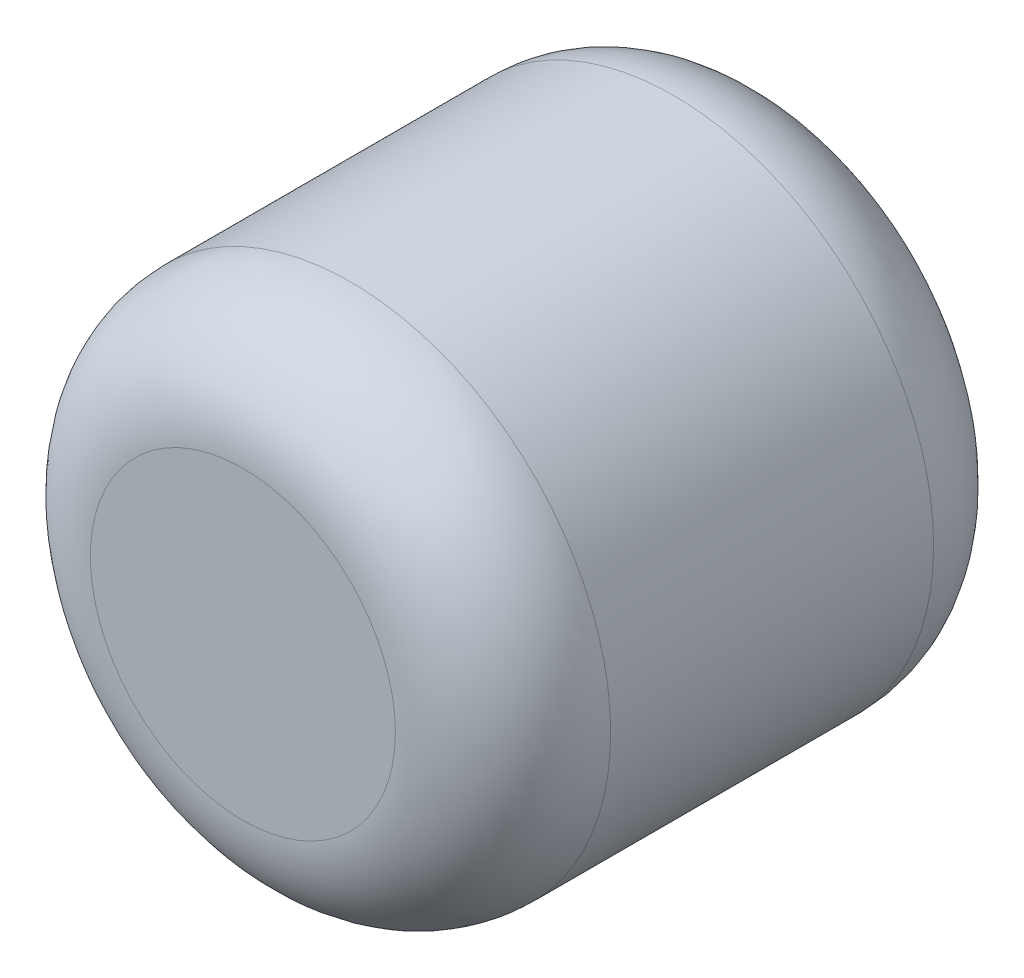
ISO-10303-21;
HEADER;
FILE_DESCRIPTION(('STEP AP214'),'2;1');
FILE_NAME('part.step','',(''),(''),'','','');
FILE_SCHEMA(('AUTOMOTIVE_DESIGN { 1 0 10303 214 1 1 1 1 }'));
ENDSEC;
DATA;
#1=APPLICATION_CONTEXT('core data for automotive mechanical design processes');
#2=APPLICATION_PROTOCOL_DEFINITION('international standard','automotive_design',2000,#1);
#3=PRODUCT_CONTEXT('',#1,'mechanical');
#4=PRODUCT('Part','Part','',(#3));
#5=PRODUCT_RELATED_PRODUCT_CATEGORY('part','',(#4));
#6=PRODUCT_DEFINITION_FORMATION('','',#4);
#7=PRODUCT_DEFINITION_CONTEXT('part definition',#1,'design');
#8=PRODUCT_DEFINITION('design','',#6,#7);
#9=PRODUCT_DEFINITION_SHAPE('','',#8);
#10=(LENGTH_UNIT() NAMED_UNIT(*) SI_UNIT(.MILLI.,.METRE.));
#11=(NAMED_UNIT(*) PLANE_ANGLE_UNIT() SI_UNIT($,.RADIAN.));
#12=(NAMED_UNIT(*) SI_UNIT($,.STERADIAN.) SOLID_ANGLE_UNIT());
#13=UNCERTAINTY_MEASURE_WITH_UNIT(LENGTH_MEASURE(1.E-05),#10,'distance_accuracy_value','');
#14=(GEOMETRIC_REPRESENTATION_CONTEXT(3) GLOBAL_UNCERTAINTY_ASSIGNED_CONTEXT((#13)) GLOBAL_UNIT_ASSIGNED_CONTEXT((#10,
#11,#12)) REPRESENTATION_CONTEXT('',''));
#15=CARTESIAN_POINT('',(0.,0.,0.));
#16=DIRECTION('',(0.,0.,1.));
#17=DIRECTION('',(1.,0.,0.));
#18=AXIS2_PLACEMENT_3D('',#15,#16,#17);
#19=CARTESIAN_POINT('',(0.,0.,15.));
#20=DIRECTION('',(0.,0.,-1.));
#21=DIRECTION('',(-1.,0.,0.));
#22=AXIS2_PLACEMENT_3D('',#19,#20,#21);
#23=CYLINDRICAL_SURFACE('',#22,7.25);
#24=CARTESIAN_POINT('',(0.,0.,12.));
#25=DIRECTION('',(0.,0.,1.));
#26=DIRECTION('',(1.,0.,0.));
#27=AXIS2_PLACEMENT_3D('',#24,#25,#26);
#28=CIRCLE('',#27,7.25);
#29=CARTESIAN_POINT('',(7.25,0.,12.));
#30=VERTEX_POINT('',#29);
#31=EDGE_CURVE('E42',#30,#30,#28,.F.);
#32=ORIENTED_EDGE('',*,*,#31,.T.);
#33=EDGE_LOOP('',(#32));
#34=FACE_BOUND('',#33,.T.);
#35=CARTESIAN_POINT('',(0.,0.,3.));
#36=DIRECTION('',(0.,0.,1.));
#37=DIRECTION('',(1.,0.,0.));
#38=AXIS2_PLACEMENT_3D('',#35,#36,#37);
#39=CIRCLE('',#38,7.25);
#40=CARTESIAN_POINT('',(7.25,0.,3.));
#41=VERTEX_POINT('',#40);
#42=EDGE_CURVE('E46',#41,#41,#39,.T.);
#43=ORIENTED_EDGE('',*,*,#42,.T.);
#44=EDGE_LOOP('',(#43));
#45=FACE_BOUND('',#44,.T.);
#46=ADVANCED_FACE('F35',(#34,#45),#23,.T.);
#47=CARTESIAN_POINT('',(0.,0.,15.));
#48=DIRECTION('',(0.,0.,1.));
#49=DIRECTION('',(1.,0.,0.));
#50=AXIS2_PLACEMENT_3D('',#47,#48,#49);
#51=PLANE('',#50);
#52=CARTESIAN_POINT('',(0.,0.,15.));
#53=DIRECTION('',(0.,0.,1.));
#54=DIRECTION('',(1.,0.,0.));
#55=AXIS2_PLACEMENT_3D('',#52,#53,#54);
#56=CIRCLE('',#55,4.25);
#57=CARTESIAN_POINT('',(4.25,0.,15.));
#58=VERTEX_POINT('',#57);
#59=EDGE_CURVE('E50',#58,#58,#56,.T.);
#60=ORIENTED_EDGE('',*,*,#59,.T.);
#61=EDGE_LOOP('',(#60));
#62=FACE_BOUND('',#61,.T.);
#63=ADVANCED_FACE('F56',(#62),#51,.T.);
#64=CARTESIAN_POINT('',(0.,0.,0.));
#65=DIRECTION('',(0.,0.,1.));
#66=DIRECTION('',(1.,0.,0.));
#67=AXIS2_PLACEMENT_3D('',#64,#65,#66);
#68=PLANE('',#67);
#69=CARTESIAN_POINT('',(0.,0.,0.));
#70=DIRECTION('',(0.,0.,1.));
#71=DIRECTION('',(1.,0.,0.));
#72=AXIS2_PLACEMENT_3D('',#69,#70,#71);
#73=CIRCLE('',#72,4.25);
#74=CARTESIAN_POINT('',(4.25,0.,0.));
#75=VERTEX_POINT('',#74);
#76=EDGE_CURVE('E10',#75,#75,#73,.F.);
#77=ORIENTED_EDGE('',*,*,#76,.T.);
#78=EDGE_LOOP('',(#77));
#79=FACE_BOUND('',#78,.T.);
#80=ADVANCED_FACE('F60',(#79),#68,.F.);
#81=CARTESIAN_POINT('',(0.,0.,12.));
#82=DIRECTION('',(0.,0.,1.));
#83=DIRECTION('',(1.,0.,0.));
#84=AXIS2_PLACEMENT_3D('',#81,#82,#83);
#85=TOROIDAL_SURFACE('',#84,4.25,3.);
#86=ORIENTED_EDGE('',*,*,#31,.F.);
#87=EDGE_LOOP('',(#86));
#88=FACE_BOUND('',#87,.T.);
#89=ORIENTED_EDGE('',*,*,#59,.F.);
#90=EDGE_LOOP('',(#89));
#91=FACE_BOUND('',#90,.T.);
#92=ADVANCED_FACE('F58',(#88,#91),#85,.T.);
#93=CARTESIAN_POINT('',(0.,0.,3.));
#94=DIRECTION('',(0.,0.,1.));
#95=DIRECTION('',(1.,0.,0.));
#96=AXIS2_PLACEMENT_3D('',#93,#94,#95);
#97=TOROIDAL_SURFACE('',#96,4.25,3.);
#98=ORIENTED_EDGE('',*,*,#76,.F.);
#99=EDGE_LOOP('',(#98));
#100=FACE_BOUND('',#99,.T.);
#101=ORIENTED_EDGE('',*,*,#42,.F.);
#102=EDGE_LOOP('',(#101));
#103=FACE_BOUND('',#102,.T.);
#104=ADVANCED_FACE('F37',(#100,#103),#97,.T.);
#105=CLOSED_SHELL('',(#46,#63,#80,#92,#104));
#106=MANIFOLD_SOLID_BREP('B2',#105);
#107=ADVANCED_BREP_SHAPE_REPRESENTATION('',(#18,#106),#14);
#108=SHAPE_DEFINITION_REPRESENTATION(#9,#107);
ENDSEC;
END-ISO-10303-21;
